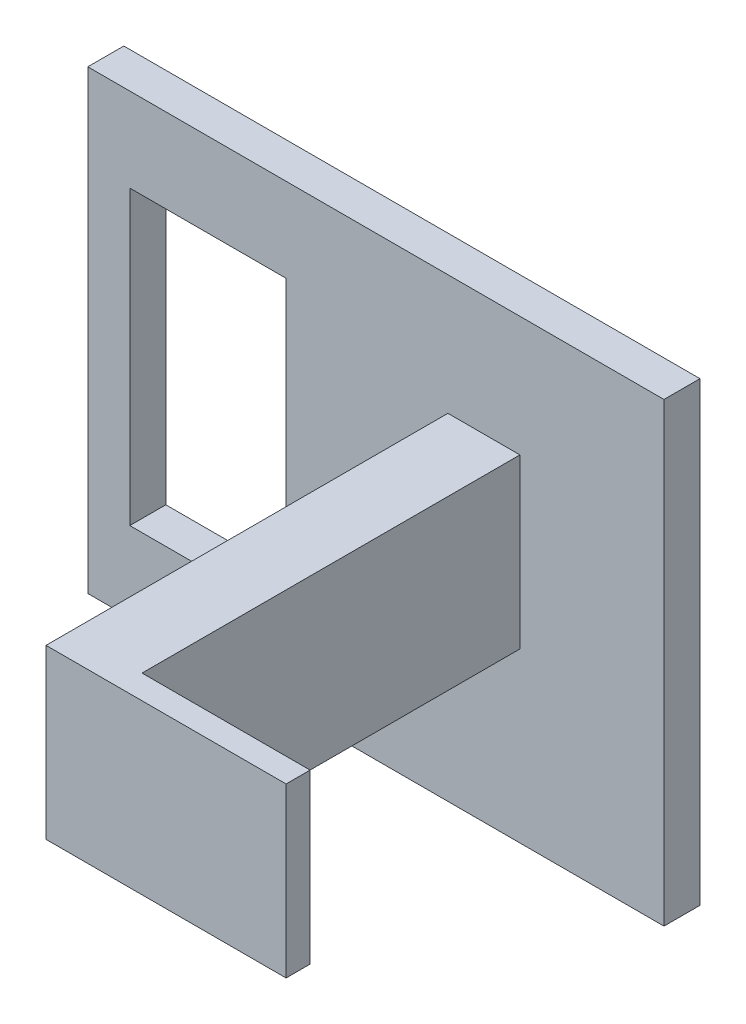
ISO-10303-21;
HEADER;
FILE_DESCRIPTION(('STEP AP214'),'2;1');
FILE_NAME('part.step','',(''),(''),'','','');
FILE_SCHEMA(('AUTOMOTIVE_DESIGN { 1 0 10303 214 1 1 1 1 }'));
ENDSEC;
DATA;
#1=APPLICATION_CONTEXT('core data for automotive mechanical design processes');
#2=APPLICATION_PROTOCOL_DEFINITION('international standard','automotive_design',2000,#1);
#3=PRODUCT_CONTEXT('',#1,'mechanical');
#4=PRODUCT('Part','Part','',(#3));
#5=PRODUCT_RELATED_PRODUCT_CATEGORY('part','',(#4));
#6=PRODUCT_DEFINITION_FORMATION('','',#4);
#7=PRODUCT_DEFINITION_CONTEXT('part definition',#1,'design');
#8=PRODUCT_DEFINITION('design','',#6,#7);
#9=PRODUCT_DEFINITION_SHAPE('','',#8);
#10=(LENGTH_UNIT() NAMED_UNIT(*) SI_UNIT(.MILLI.,.METRE.));
#11=(NAMED_UNIT(*) PLANE_ANGLE_UNIT() SI_UNIT($,.RADIAN.));
#12=(NAMED_UNIT(*) SI_UNIT($,.STERADIAN.) SOLID_ANGLE_UNIT());
#13=UNCERTAINTY_MEASURE_WITH_UNIT(LENGTH_MEASURE(1.E-05),#10,'distance_accuracy_value','');
#14=(GEOMETRIC_REPRESENTATION_CONTEXT(3) GLOBAL_UNCERTAINTY_ASSIGNED_CONTEXT((#13)) GLOBAL_UNIT_ASSIGNED_CONTEXT((#10,
#11,#12)) REPRESENTATION_CONTEXT('',''));
#15=CARTESIAN_POINT('',(0.,0.,0.));
#16=DIRECTION('',(0.,0.,1.));
#17=DIRECTION('',(1.,0.,0.));
#18=AXIS2_PLACEMENT_3D('',#15,#16,#17);
#19=CARTESIAN_POINT('',(0.,0.,-33.480025));
#20=DIRECTION('',(0.,0.,-1.));
#21=DIRECTION('',(-1.,0.,0.));
#22=AXIS2_PLACEMENT_3D('',#19,#20,#21);
#23=PLANE('',#22);
#24=DIRECTION('',(0.,-1.,0.));
#25=VECTOR('',#24,1.);
#26=CARTESIAN_POINT('',(-66.5,6.65,-33.480025));
#27=LINE('',#26,#25);
#28=CARTESIAN_POINT('',(-66.5,31.,-33.480025));
#29=VERTEX_POINT('',#28);
#30=CARTESIAN_POINT('',(-66.5,6.65,-33.480025));
#31=VERTEX_POINT('',#30);
#32=EDGE_CURVE('E178',#29,#31,#27,.T.);
#33=ORIENTED_EDGE('',*,*,#32,.F.);
#34=DIRECTION('',(-1.,0.,0.));
#35=VECTOR('',#34,1.);
#36=CARTESIAN_POINT('',(-66.5,31.,-33.480025));
#37=LINE('',#36,#35);
#38=CARTESIAN_POINT('',(-53.5,31.,-33.480025));
#39=VERTEX_POINT('',#38);
#40=EDGE_CURVE('E188',#39,#29,#37,.T.);
#41=ORIENTED_EDGE('',*,*,#40,.F.);
#42=DIRECTION('',(0.,1.,0.));
#43=VECTOR('',#42,1.);
#44=CARTESIAN_POINT('',(-53.5,6.65,-33.480025));
#45=LINE('',#44,#43);
#46=CARTESIAN_POINT('',(-53.5,6.65,-33.480025));
#47=VERTEX_POINT('',#46);
#48=EDGE_CURVE('E183',#47,#39,#45,.T.);
#49=ORIENTED_EDGE('',*,*,#48,.F.);
#50=DIRECTION('',(1.,0.,0.));
#51=VECTOR('',#50,1.);
#52=CARTESIAN_POINT('',(-66.5,6.65,-33.480025));
#53=LINE('',#52,#51);
#54=EDGE_CURVE('E185',#31,#47,#53,.T.);
#55=ORIENTED_EDGE('',*,*,#54,.F.);
#56=EDGE_LOOP('',(#33,#41,#49,#55));
#57=FACE_BOUND('',#56,.T.);
#58=DIRECTION('',(0.,-1.,0.));
#59=VECTOR('',#58,1.);
#60=CARTESIAN_POINT('',(-70.,0.,-33.480025));
#61=LINE('',#60,#59);
#62=CARTESIAN_POINT('',(-70.,38.,-33.480025));
#63=VERTEX_POINT('',#62);
#64=CARTESIAN_POINT('',(-70.,0.,-33.480025));
#65=VERTEX_POINT('',#64);
#66=EDGE_CURVE('E211',#63,#65,#61,.T.);
#67=ORIENTED_EDGE('',*,*,#66,.T.);
#68=DIRECTION('',(1.,0.,0.));
#69=VECTOR('',#68,1.);
#70=CARTESIAN_POINT('',(-70.,0.,-33.480025));
#71=LINE('',#70,#69);
#72=CARTESIAN_POINT('',(-22.,0.,-33.480025));
#73=VERTEX_POINT('',#72);
#74=EDGE_CURVE('E212',#65,#73,#71,.T.);
#75=ORIENTED_EDGE('',*,*,#74,.T.);
#76=DIRECTION('',(0.,1.,0.));
#77=VECTOR('',#76,1.);
#78=CARTESIAN_POINT('',(-22.,0.,-33.480025));
#79=LINE('',#78,#77);
#80=CARTESIAN_POINT('',(-22.,38.,-33.480025));
#81=VERTEX_POINT('',#80);
#82=EDGE_CURVE('E220',#73,#81,#79,.T.);
#83=ORIENTED_EDGE('',*,*,#82,.T.);
#84=DIRECTION('',(-1.,0.,0.));
#85=VECTOR('',#84,1.);
#86=CARTESIAN_POINT('',(-70.,38.,-33.480025));
#87=LINE('',#86,#85);
#88=EDGE_CURVE('E218',#81,#63,#87,.T.);
#89=ORIENTED_EDGE('',*,*,#88,.T.);
#90=EDGE_LOOP('',(#67,#75,#83,#89));
#91=FACE_BOUND('',#90,.T.);
#92=DIRECTION('',(0.,-1.,0.));
#93=VECTOR('',#92,1.);
#94=CARTESIAN_POINT('',(-40.,0.,-33.480025));
#95=LINE('',#94,#93);
#96=CARTESIAN_POINT('',(-40.,28.,-33.480025));
#97=VERTEX_POINT('',#96);
#98=CARTESIAN_POINT('',(-40.,14.,-33.480025));
#99=VERTEX_POINT('',#98);
#100=EDGE_CURVE('E50',#97,#99,#95,.T.);
#101=ORIENTED_EDGE('',*,*,#100,.F.);
#102=DIRECTION('',(-1.,0.,0.));
#103=VECTOR('',#102,1.);
#104=CARTESIAN_POINT('',(0.,28.,-33.480025));
#105=LINE('',#104,#103);
#106=CARTESIAN_POINT('',(-34.,28.,-33.480025));
#107=VERTEX_POINT('',#106);
#108=EDGE_CURVE('E238',#107,#97,#105,.T.);
#109=ORIENTED_EDGE('',*,*,#108,.F.);
#110=DIRECTION('',(0.,1.,0.));
#111=VECTOR('',#110,1.);
#112=CARTESIAN_POINT('',(-34.,0.,-33.480025));
#113=LINE('',#112,#111);
#114=CARTESIAN_POINT('',(-34.,14.,-33.480025));
#115=VERTEX_POINT('',#114);
#116=EDGE_CURVE('E243',#115,#107,#113,.T.);
#117=ORIENTED_EDGE('',*,*,#116,.F.);
#118=DIRECTION('',(1.,0.,0.));
#119=VECTOR('',#118,1.);
#120=CARTESIAN_POINT('',(0.,14.,-33.480025));
#121=LINE('',#120,#119);
#122=EDGE_CURVE('E247',#99,#115,#121,.T.);
#123=ORIENTED_EDGE('',*,*,#122,.F.);
#124=EDGE_LOOP('',(#101,#109,#117,#123));
#125=FACE_BOUND('',#124,.T.);
#126=ADVANCED_FACE('F39',(#57,#91,#125),#23,.F.);
#127=CARTESIAN_POINT('',(0.,0.,-36.480025));
#128=DIRECTION('',(0.,0.,-1.));
#129=DIRECTION('',(-1.,0.,0.));
#130=AXIS2_PLACEMENT_3D('',#127,#128,#129);
#131=PLANE('',#130);
#132=DIRECTION('',(0.,-1.,0.));
#133=VECTOR('',#132,1.);
#134=CARTESIAN_POINT('',(-70.,0.,-36.480025));
#135=LINE('',#134,#133);
#136=CARTESIAN_POINT('',(-70.,38.,-36.480025));
#137=VERTEX_POINT('',#136);
#138=CARTESIAN_POINT('',(-70.,0.,-36.480025));
#139=VERTEX_POINT('',#138);
#140=EDGE_CURVE('E209',#137,#139,#135,.T.);
#141=ORIENTED_EDGE('',*,*,#140,.F.);
#142=DIRECTION('',(-1.,0.,0.));
#143=VECTOR('',#142,1.);
#144=CARTESIAN_POINT('',(-70.,38.,-36.480025));
#145=LINE('',#144,#143);
#146=CARTESIAN_POINT('',(-22.,38.,-36.480025));
#147=VERTEX_POINT('',#146);
#148=EDGE_CURVE('E214',#147,#137,#145,.T.);
#149=ORIENTED_EDGE('',*,*,#148,.F.);
#150=DIRECTION('',(0.,1.,0.));
#151=VECTOR('',#150,1.);
#152=CARTESIAN_POINT('',(-22.,0.,-36.480025));
#153=LINE('',#152,#151);
#154=CARTESIAN_POINT('',(-22.,0.,-36.480025));
#155=VERTEX_POINT('',#154);
#156=EDGE_CURVE('E227',#155,#147,#153,.T.);
#157=ORIENTED_EDGE('',*,*,#156,.F.);
#158=DIRECTION('',(1.,0.,0.));
#159=VECTOR('',#158,1.);
#160=CARTESIAN_POINT('',(-70.,0.,-36.480025));
#161=LINE('',#160,#159);
#162=EDGE_CURVE('E221',#139,#155,#161,.T.);
#163=ORIENTED_EDGE('',*,*,#162,.F.);
#164=EDGE_LOOP('',(#141,#149,#157,#163));
#165=FACE_BOUND('',#164,.T.);
#166=DIRECTION('',(-1.,0.,0.));
#167=VECTOR('',#166,1.);
#168=CARTESIAN_POINT('',(-66.5,31.,-36.480025));
#169=LINE('',#168,#167);
#170=CARTESIAN_POINT('',(-53.5,31.,-36.480025));
#171=VERTEX_POINT('',#170);
#172=CARTESIAN_POINT('',(-66.5,31.,-36.480025));
#173=VERTEX_POINT('',#172);
#174=EDGE_CURVE('E181',#171,#173,#169,.T.);
#175=ORIENTED_EDGE('',*,*,#174,.T.);
#176=DIRECTION('',(0.,-1.,0.));
#177=VECTOR('',#176,1.);
#178=CARTESIAN_POINT('',(-66.5,6.65,-36.480025));
#179=LINE('',#178,#177);
#180=CARTESIAN_POINT('',(-66.5,6.65,-36.480025));
#181=VERTEX_POINT('',#180);
#182=EDGE_CURVE('E145',#173,#181,#179,.T.);
#183=ORIENTED_EDGE('',*,*,#182,.T.);
#184=DIRECTION('',(1.,0.,0.));
#185=VECTOR('',#184,1.);
#186=CARTESIAN_POINT('',(-66.5,6.65,-36.480025));
#187=LINE('',#186,#185);
#188=CARTESIAN_POINT('',(-53.5,6.65,-36.480025));
#189=VERTEX_POINT('',#188);
#190=EDGE_CURVE('E195',#181,#189,#187,.T.);
#191=ORIENTED_EDGE('',*,*,#190,.T.);
#192=DIRECTION('',(0.,1.,0.));
#193=VECTOR('',#192,1.);
#194=CARTESIAN_POINT('',(-53.5,6.65,-36.480025));
#195=LINE('',#194,#193);
#196=EDGE_CURVE('E198',#189,#171,#195,.T.);
#197=ORIENTED_EDGE('',*,*,#196,.T.);
#198=EDGE_LOOP('',(#175,#183,#191,#197));
#199=FACE_BOUND('',#198,.T.);
#200=ADVANCED_FACE('F269',(#165,#199),#131,.T.);
#201=CARTESIAN_POINT('',(-70.,0.,-33.480025));
#202=DIRECTION('',(1.,0.,0.));
#203=DIRECTION('',(0.,0.,-1.));
#204=AXIS2_PLACEMENT_3D('',#201,#202,#203);
#205=PLANE('',#204);
#206=ORIENTED_EDGE('',*,*,#140,.T.);
#207=DIRECTION('',(0.,0.,-1.));
#208=VECTOR('',#207,1.);
#209=CARTESIAN_POINT('',(-70.,0.,-33.480025));
#210=LINE('',#209,#208);
#211=EDGE_CURVE('E240',#65,#139,#210,.T.);
#212=ORIENTED_EDGE('',*,*,#211,.F.);
#213=ORIENTED_EDGE('',*,*,#66,.F.);
#214=DIRECTION('',(0.,0.,-1.));
#215=VECTOR('',#214,1.);
#216=CARTESIAN_POINT('',(-70.,38.,-33.480025));
#217=LINE('',#216,#215);
#218=EDGE_CURVE('E222',#63,#137,#217,.T.);
#219=ORIENTED_EDGE('',*,*,#218,.T.);
#220=EDGE_LOOP('',(#206,#212,#213,#219));
#221=FACE_BOUND('',#220,.T.);
#222=ADVANCED_FACE('F41',(#221),#205,.F.);
#223=CARTESIAN_POINT('',(-70.,0.,-33.480025));
#224=DIRECTION('',(0.,1.,0.));
#225=DIRECTION('',(0.,0.,1.));
#226=AXIS2_PLACEMENT_3D('',#223,#224,#225);
#227=PLANE('',#226);
#228=ORIENTED_EDGE('',*,*,#162,.T.);
#229=DIRECTION('',(0.,0.,-1.));
#230=VECTOR('',#229,1.);
#231=CARTESIAN_POINT('',(-22.,0.,-33.480025));
#232=LINE('',#231,#230);
#233=EDGE_CURVE('E231',#73,#155,#232,.T.);
#234=ORIENTED_EDGE('',*,*,#233,.F.);
#235=ORIENTED_EDGE('',*,*,#74,.F.);
#236=ORIENTED_EDGE('',*,*,#211,.T.);
#237=EDGE_LOOP('',(#228,#234,#235,#236));
#238=FACE_BOUND('',#237,.T.);
#239=ADVANCED_FACE('F295',(#238),#227,.F.);
#240=CARTESIAN_POINT('',(-22.,0.,-33.480025));
#241=DIRECTION('',(-1.,0.,0.));
#242=DIRECTION('',(0.,0.,1.));
#243=AXIS2_PLACEMENT_3D('',#240,#241,#242);
#244=PLANE('',#243);
#245=ORIENTED_EDGE('',*,*,#156,.T.);
#246=DIRECTION('',(0.,0.,-1.));
#247=VECTOR('',#246,1.);
#248=CARTESIAN_POINT('',(-22.,38.,-33.480025));
#249=LINE('',#248,#247);
#250=EDGE_CURVE('E232',#81,#147,#249,.T.);
#251=ORIENTED_EDGE('',*,*,#250,.F.);
#252=ORIENTED_EDGE('',*,*,#82,.F.);
#253=ORIENTED_EDGE('',*,*,#233,.T.);
#254=EDGE_LOOP('',(#245,#251,#252,#253));
#255=FACE_BOUND('',#254,.T.);
#256=ADVANCED_FACE('F286',(#255),#244,.F.);
#257=CARTESIAN_POINT('',(-70.,38.,-33.480025));
#258=DIRECTION('',(0.,-1.,0.));
#259=DIRECTION('',(0.,0.,-1.));
#260=AXIS2_PLACEMENT_3D('',#257,#258,#259);
#261=PLANE('',#260);
#262=ORIENTED_EDGE('',*,*,#148,.T.);
#263=ORIENTED_EDGE('',*,*,#218,.F.);
#264=ORIENTED_EDGE('',*,*,#88,.F.);
#265=ORIENTED_EDGE('',*,*,#250,.T.);
#266=EDGE_LOOP('',(#262,#263,#264,#265));
#267=FACE_BOUND('',#266,.T.);
#268=ADVANCED_FACE('F287',(#267),#261,.F.);
#269=CARTESIAN_POINT('',(-66.5,6.65,-33.480025));
#270=DIRECTION('',(1.,0.,0.));
#271=DIRECTION('',(0.,0.,-1.));
#272=AXIS2_PLACEMENT_3D('',#269,#270,#271);
#273=PLANE('',#272);
#274=ORIENTED_EDGE('',*,*,#182,.F.);
#275=DIRECTION('',(0.,0.,-1.));
#276=VECTOR('',#275,1.);
#277=CARTESIAN_POINT('',(-66.5,31.,-33.480025));
#278=LINE('',#277,#276);
#279=EDGE_CURVE('E186',#29,#173,#278,.T.);
#280=ORIENTED_EDGE('',*,*,#279,.F.);
#281=ORIENTED_EDGE('',*,*,#32,.T.);
#282=DIRECTION('',(0.,0.,-1.));
#283=VECTOR('',#282,1.);
#284=CARTESIAN_POINT('',(-66.5,6.65,-33.480025));
#285=LINE('',#284,#283);
#286=EDGE_CURVE('E210',#31,#181,#285,.T.);
#287=ORIENTED_EDGE('',*,*,#286,.T.);
#288=EDGE_LOOP('',(#274,#280,#281,#287));
#289=FACE_BOUND('',#288,.T.);
#290=ADVANCED_FACE('F283',(#289),#273,.T.);
#291=CARTESIAN_POINT('',(-66.5,6.65,-33.480025));
#292=DIRECTION('',(0.,1.,0.));
#293=DIRECTION('',(0.,0.,1.));
#294=AXIS2_PLACEMENT_3D('',#291,#292,#293);
#295=PLANE('',#294);
#296=ORIENTED_EDGE('',*,*,#190,.F.);
#297=ORIENTED_EDGE('',*,*,#286,.F.);
#298=ORIENTED_EDGE('',*,*,#54,.T.);
#299=DIRECTION('',(0.,0.,-1.));
#300=VECTOR('',#299,1.);
#301=CARTESIAN_POINT('',(-53.5,6.65,-33.480025));
#302=LINE('',#301,#300);
#303=EDGE_CURVE('E202',#47,#189,#302,.T.);
#304=ORIENTED_EDGE('',*,*,#303,.T.);
#305=EDGE_LOOP('',(#296,#297,#298,#304));
#306=FACE_BOUND('',#305,.T.);
#307=ADVANCED_FACE('F323',(#306),#295,.T.);
#308=CARTESIAN_POINT('',(-53.5,6.65,-33.480025));
#309=DIRECTION('',(-1.,0.,0.));
#310=DIRECTION('',(0.,0.,1.));
#311=AXIS2_PLACEMENT_3D('',#308,#309,#310);
#312=PLANE('',#311);
#313=ORIENTED_EDGE('',*,*,#196,.F.);
#314=ORIENTED_EDGE('',*,*,#303,.F.);
#315=ORIENTED_EDGE('',*,*,#48,.T.);
#316=DIRECTION('',(0.,0.,-1.));
#317=VECTOR('',#316,1.);
#318=CARTESIAN_POINT('',(-53.5,31.,-33.480025));
#319=LINE('',#318,#317);
#320=EDGE_CURVE('E201',#39,#171,#319,.T.);
#321=ORIENTED_EDGE('',*,*,#320,.T.);
#322=EDGE_LOOP('',(#313,#314,#315,#321));
#323=FACE_BOUND('',#322,.T.);
#324=ADVANCED_FACE('F324',(#323),#312,.T.);
#325=CARTESIAN_POINT('',(-66.5,31.,-33.480025));
#326=DIRECTION('',(0.,-1.,0.));
#327=DIRECTION('',(0.,0.,-1.));
#328=AXIS2_PLACEMENT_3D('',#325,#326,#327);
#329=PLANE('',#328);
#330=ORIENTED_EDGE('',*,*,#174,.F.);
#331=ORIENTED_EDGE('',*,*,#320,.F.);
#332=ORIENTED_EDGE('',*,*,#40,.T.);
#333=ORIENTED_EDGE('',*,*,#279,.T.);
#334=EDGE_LOOP('',(#330,#331,#332,#333));
#335=FACE_BOUND('',#334,.T.);
#336=ADVANCED_FACE('F314',(#335),#329,.T.);
#337=CARTESIAN_POINT('',(-40.,14.,-1.));
#338=DIRECTION('',(1.,0.,0.));
#339=DIRECTION('',(0.,0.,-1.));
#340=AXIS2_PLACEMENT_3D('',#337,#338,#339);
#341=PLANE('',#340);
#342=DIRECTION('',(0.,0.,-1.));
#343=VECTOR('',#342,1.);
#344=CARTESIAN_POINT('',(-40.,28.,-1.));
#345=LINE('',#344,#343);
#346=CARTESIAN_POINT('',(-40.,28.,0.));
#347=VERTEX_POINT('',#346);
#348=EDGE_CURVE('E171',#347,#97,#345,.T.);
#349=ORIENTED_EDGE('',*,*,#348,.T.);
#350=ORIENTED_EDGE('',*,*,#100,.T.);
#351=DIRECTION('',(0.,0.,-1.));
#352=VECTOR('',#351,1.);
#353=CARTESIAN_POINT('',(-40.,14.,-1.));
#354=LINE('',#353,#352);
#355=CARTESIAN_POINT('',(-40.,14.,0.));
#356=VERTEX_POINT('',#355);
#357=EDGE_CURVE('E62',#356,#99,#354,.T.);
#358=ORIENTED_EDGE('',*,*,#357,.F.);
#359=DIRECTION('',(0.,-1.,0.));
#360=VECTOR('',#359,1.);
#361=CARTESIAN_POINT('',(-40.,14.,0.));
#362=LINE('',#361,#360);
#363=EDGE_CURVE('E142',#347,#356,#362,.T.);
#364=ORIENTED_EDGE('',*,*,#363,.F.);
#365=EDGE_LOOP('',(#349,#350,#358,#364));
#366=FACE_BOUND('',#365,.T.);
#367=ADVANCED_FACE('F138',(#366),#341,.F.);
#368=CARTESIAN_POINT('',(-40.,14.,-1.));
#369=DIRECTION('',(0.,1.,0.));
#370=DIRECTION('',(0.,0.,1.));
#371=AXIS2_PLACEMENT_3D('',#368,#369,#370);
#372=PLANE('',#371);
#373=DIRECTION('',(0.,0.,-1.));
#374=VECTOR('',#373,1.);
#375=CARTESIAN_POINT('',(-34.,14.,-1.));
#376=LINE('',#375,#374);
#377=CARTESIAN_POINT('',(-34.,14.,-2.));
#378=VERTEX_POINT('',#377);
#379=EDGE_CURVE('E144',#378,#115,#376,.T.);
#380=ORIENTED_EDGE('',*,*,#379,.F.);
#381=DIRECTION('',(1.,0.,0.));
#382=VECTOR('',#381,1.);
#383=CARTESIAN_POINT('',(-40.,14.,-2.));
#384=LINE('',#383,#382);
#385=CARTESIAN_POINT('',(-20.,14.,-2.));
#386=VERTEX_POINT('',#385);
#387=EDGE_CURVE('E53',#378,#386,#384,.T.);
#388=ORIENTED_EDGE('',*,*,#387,.T.);
#389=DIRECTION('',(0.,0.,-1.));
#390=VECTOR('',#389,1.);
#391=CARTESIAN_POINT('',(-20.,14.,0.));
#392=LINE('',#391,#390);
#393=CARTESIAN_POINT('',(-20.,14.,0.));
#394=VERTEX_POINT('',#393);
#395=EDGE_CURVE('E155',#394,#386,#392,.T.);
#396=ORIENTED_EDGE('',*,*,#395,.F.);
#397=DIRECTION('',(1.,0.,0.));
#398=VECTOR('',#397,1.);
#399=CARTESIAN_POINT('',(-40.,14.,0.));
#400=LINE('',#399,#398);
#401=EDGE_CURVE('E146',#356,#394,#400,.T.);
#402=ORIENTED_EDGE('',*,*,#401,.F.);
#403=ORIENTED_EDGE('',*,*,#357,.T.);
#404=ORIENTED_EDGE('',*,*,#122,.T.);
#405=EDGE_LOOP('',(#380,#388,#396,#402,#403,#404));
#406=FACE_BOUND('',#405,.T.);
#407=ADVANCED_FACE('F147',(#406),#372,.F.);
#408=CARTESIAN_POINT('',(-34.,14.,-1.));
#409=DIRECTION('',(-1.,0.,0.));
#410=DIRECTION('',(0.,0.,1.));
#411=AXIS2_PLACEMENT_3D('',#408,#409,#410);
#412=PLANE('',#411);
#413=DIRECTION('',(0.,0.,-1.));
#414=VECTOR('',#413,1.);
#415=CARTESIAN_POINT('',(-34.,28.,-1.));
#416=LINE('',#415,#414);
#417=CARTESIAN_POINT('',(-34.,28.,-2.));
#418=VERTEX_POINT('',#417);
#419=EDGE_CURVE('E179',#418,#107,#416,.T.);
#420=ORIENTED_EDGE('',*,*,#419,.F.);
#421=DIRECTION('',(0.,-1.,0.));
#422=VECTOR('',#421,1.);
#423=CARTESIAN_POINT('',(-34.,14.,-2.));
#424=LINE('',#423,#422);
#425=EDGE_CURVE('E11',#418,#378,#424,.T.);
#426=ORIENTED_EDGE('',*,*,#425,.T.);
#427=ORIENTED_EDGE('',*,*,#379,.T.);
#428=ORIENTED_EDGE('',*,*,#116,.T.);
#429=EDGE_LOOP('',(#420,#426,#427,#428));
#430=FACE_BOUND('',#429,.T.);
#431=ADVANCED_FACE('F252',(#430),#412,.F.);
#432=CARTESIAN_POINT('',(-40.,28.,-1.));
#433=DIRECTION('',(0.,-1.,0.));
#434=DIRECTION('',(0.,0.,-1.));
#435=AXIS2_PLACEMENT_3D('',#432,#433,#434);
#436=PLANE('',#435);
#437=DIRECTION('',(-1.,0.,0.));
#438=VECTOR('',#437,1.);
#439=CARTESIAN_POINT('',(-40.,28.,-2.));
#440=LINE('',#439,#438);
#441=CARTESIAN_POINT('',(-20.,28.,-2.));
#442=VERTEX_POINT('',#441);
#443=EDGE_CURVE('E161',#442,#418,#440,.T.);
#444=ORIENTED_EDGE('',*,*,#443,.T.);
#445=ORIENTED_EDGE('',*,*,#419,.T.);
#446=ORIENTED_EDGE('',*,*,#108,.T.);
#447=ORIENTED_EDGE('',*,*,#348,.F.);
#448=DIRECTION('',(-1.,0.,0.));
#449=VECTOR('',#448,1.);
#450=CARTESIAN_POINT('',(-40.,28.,0.));
#451=LINE('',#450,#449);
#452=CARTESIAN_POINT('',(-20.,28.,0.));
#453=VERTEX_POINT('',#452);
#454=EDGE_CURVE('E159',#453,#347,#451,.T.);
#455=ORIENTED_EDGE('',*,*,#454,.F.);
#456=DIRECTION('',(0.,0.,-1.));
#457=VECTOR('',#456,1.);
#458=CARTESIAN_POINT('',(-20.,28.,0.));
#459=LINE('',#458,#457);
#460=EDGE_CURVE('E166',#453,#442,#459,.T.);
#461=ORIENTED_EDGE('',*,*,#460,.T.);
#462=EDGE_LOOP('',(#444,#445,#446,#447,#455,#461));
#463=FACE_BOUND('',#462,.T.);
#464=ADVANCED_FACE('F258',(#463),#436,.F.);
#465=CARTESIAN_POINT('',(0.,0.,-2.));
#466=DIRECTION('',(0.,0.,-1.));
#467=DIRECTION('',(-1.,0.,0.));
#468=AXIS2_PLACEMENT_3D('',#465,#466,#467);
#469=PLANE('',#468);
#470=ORIENTED_EDGE('',*,*,#425,.F.);
#471=ORIENTED_EDGE('',*,*,#443,.F.);
#472=DIRECTION('',(0.,1.,0.));
#473=VECTOR('',#472,1.);
#474=CARTESIAN_POINT('',(-20.,14.,-2.));
#475=LINE('',#474,#473);
#476=EDGE_CURVE('E163',#386,#442,#475,.T.);
#477=ORIENTED_EDGE('',*,*,#476,.F.);
#478=ORIENTED_EDGE('',*,*,#387,.F.);
#479=EDGE_LOOP('',(#470,#471,#477,#478));
#480=FACE_BOUND('',#479,.T.);
#481=ADVANCED_FACE('F255',(#480),#469,.T.);
#482=CARTESIAN_POINT('',(-20.,14.,0.));
#483=DIRECTION('',(-1.,0.,0.));
#484=DIRECTION('',(0.,0.,1.));
#485=AXIS2_PLACEMENT_3D('',#482,#483,#484);
#486=PLANE('',#485);
#487=ORIENTED_EDGE('',*,*,#476,.T.);
#488=ORIENTED_EDGE('',*,*,#460,.F.);
#489=DIRECTION('',(0.,1.,0.));
#490=VECTOR('',#489,1.);
#491=CARTESIAN_POINT('',(-20.,14.,0.));
#492=LINE('',#491,#490);
#493=EDGE_CURVE('E154',#394,#453,#492,.T.);
#494=ORIENTED_EDGE('',*,*,#493,.F.);
#495=ORIENTED_EDGE('',*,*,#395,.T.);
#496=EDGE_LOOP('',(#487,#488,#494,#495));
#497=FACE_BOUND('',#496,.T.);
#498=ADVANCED_FACE('F259',(#497),#486,.F.);
#499=CARTESIAN_POINT('',(0.,0.,0.));
#500=DIRECTION('',(0.,0.,-1.));
#501=DIRECTION('',(-1.,0.,0.));
#502=AXIS2_PLACEMENT_3D('',#499,#500,#501);
#503=PLANE('',#502);
#504=ORIENTED_EDGE('',*,*,#363,.T.);
#505=ORIENTED_EDGE('',*,*,#401,.T.);
#506=ORIENTED_EDGE('',*,*,#493,.T.);
#507=ORIENTED_EDGE('',*,*,#454,.T.);
#508=EDGE_LOOP('',(#504,#505,#506,#507));
#509=FACE_BOUND('',#508,.T.);
#510=ADVANCED_FACE('F158',(#509),#503,.F.);
#511=CLOSED_SHELL('',(#126,#200,#222,#239,#256,#268,#290,#307,#324,#336,#367,#407,#431,#464,
#481,#498,#510));
#512=MANIFOLD_SOLID_BREP('B2',#511);
#513=ADVANCED_BREP_SHAPE_REPRESENTATION('',(#18,#512),#14);
#514=SHAPE_DEFINITION_REPRESENTATION(#9,#513);
ENDSEC;
END-ISO-10303-21;
